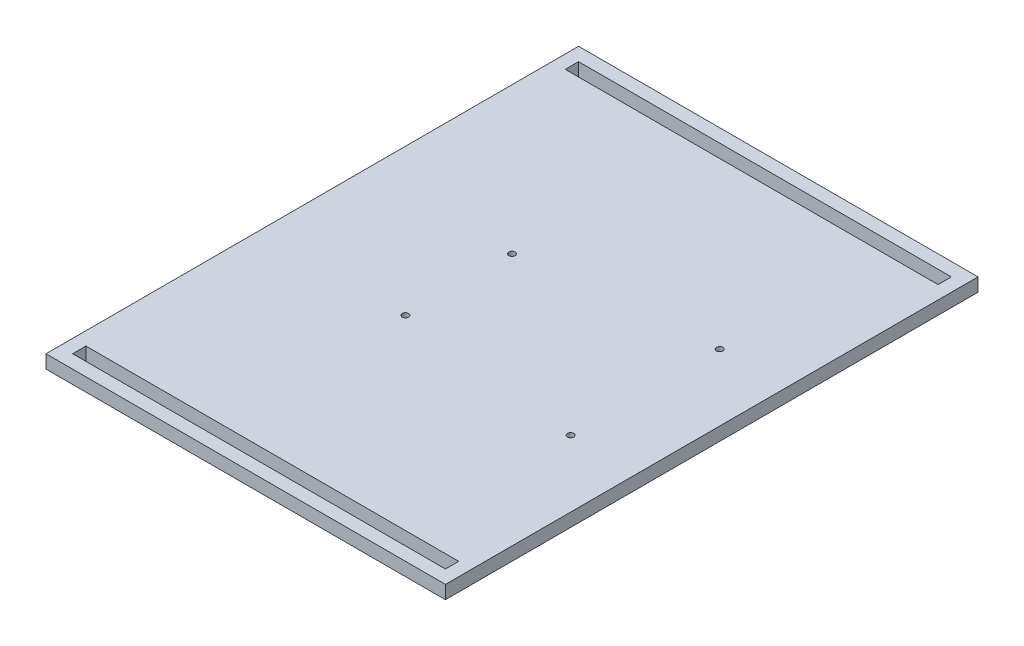
ISO-10303-21;
HEADER;
FILE_DESCRIPTION(('STEP AP214'),'2;1');
FILE_NAME('part.step','',(''),(''),'','','');
FILE_SCHEMA(('AUTOMOTIVE_DESIGN { 1 0 10303 214 1 1 1 1 }'));
ENDSEC;
DATA;
#1=APPLICATION_CONTEXT('core data for automotive mechanical design processes');
#2=APPLICATION_PROTOCOL_DEFINITION('international standard','automotive_design',2000,#1);
#3=PRODUCT_CONTEXT('',#1,'mechanical');
#4=PRODUCT('Part','Part','',(#3));
#5=PRODUCT_RELATED_PRODUCT_CATEGORY('part','',(#4));
#6=PRODUCT_DEFINITION_FORMATION('','',#4);
#7=PRODUCT_DEFINITION_CONTEXT('part definition',#1,'design');
#8=PRODUCT_DEFINITION('design','',#6,#7);
#9=PRODUCT_DEFINITION_SHAPE('','',#8);
#10=(LENGTH_UNIT() NAMED_UNIT(*) SI_UNIT(.MILLI.,.METRE.));
#11=(NAMED_UNIT(*) PLANE_ANGLE_UNIT() SI_UNIT($,.RADIAN.));
#12=(NAMED_UNIT(*) SI_UNIT($,.STERADIAN.) SOLID_ANGLE_UNIT());
#13=UNCERTAINTY_MEASURE_WITH_UNIT(LENGTH_MEASURE(1.E-05),#10,'distance_accuracy_value','');
#14=(GEOMETRIC_REPRESENTATION_CONTEXT(3) GLOBAL_UNCERTAINTY_ASSIGNED_CONTEXT((#13)) GLOBAL_UNIT_ASSIGNED_CONTEXT((#10,
#11,#12)) REPRESENTATION_CONTEXT('',''));
#15=CARTESIAN_POINT('',(0.,0.,0.));
#16=DIRECTION('',(0.,0.,1.));
#17=DIRECTION('',(1.,0.,0.));
#18=AXIS2_PLACEMENT_3D('',#15,#16,#17);
#19=CARTESIAN_POINT('',(-75.,100.,100.));
#20=DIRECTION('',(0.,0.,-1.));
#21=DIRECTION('',(-1.,0.,0.));
#22=AXIS2_PLACEMENT_3D('',#19,#20,#21);
#23=PLANE('',#22);
#24=DIRECTION('',(1.,0.,0.));
#25=VECTOR('',#24,1.);
#26=CARTESIAN_POINT('',(-75.,95.,100.));
#27=LINE('',#26,#25);
#28=CARTESIAN_POINT('',(-75.,95.,100.));
#29=VERTEX_POINT('',#28);
#30=CARTESIAN_POINT('',(75.,95.,100.));
#31=VERTEX_POINT('',#30);
#32=EDGE_CURVE('E181',#29,#31,#27,.T.);
#33=ORIENTED_EDGE('',*,*,#32,.T.);
#34=DIRECTION('',(0.,-1.,0.));
#35=VECTOR('',#34,1.);
#36=CARTESIAN_POINT('',(75.,100.,100.));
#37=LINE('',#36,#35);
#38=CARTESIAN_POINT('',(75.,100.,100.));
#39=VERTEX_POINT('',#38);
#40=EDGE_CURVE('E205',#39,#31,#37,.T.);
#41=ORIENTED_EDGE('',*,*,#40,.F.);
#42=DIRECTION('',(1.,0.,0.));
#43=VECTOR('',#42,1.);
#44=CARTESIAN_POINT('',(-75.,100.,100.));
#45=LINE('',#44,#43);
#46=CARTESIAN_POINT('',(-75.,100.,100.));
#47=VERTEX_POINT('',#46);
#48=EDGE_CURVE('E309',#47,#39,#45,.T.);
#49=ORIENTED_EDGE('',*,*,#48,.F.);
#50=DIRECTION('',(0.,-1.,0.));
#51=VECTOR('',#50,1.);
#52=CARTESIAN_POINT('',(-75.,100.,100.));
#53=LINE('',#52,#51);
#54=EDGE_CURVE('E197',#47,#29,#53,.T.);
#55=ORIENTED_EDGE('',*,*,#54,.T.);
#56=EDGE_LOOP('',(#33,#41,#49,#55));
#57=FACE_BOUND('',#56,.T.);
#58=ADVANCED_FACE('F83',(#57),#23,.F.);
#59=CARTESIAN_POINT('',(70.,100.,-100.));
#60=DIRECTION('',(-1.,0.,0.));
#61=DIRECTION('',(0.,0.,1.));
#62=AXIS2_PLACEMENT_3D('',#59,#60,#61);
#63=PLANE('',#62);
#64=DIRECTION('',(0.,0.,-1.));
#65=VECTOR('',#64,1.);
#66=CARTESIAN_POINT('',(70.,95.,-100.));
#67=LINE('',#66,#65);
#68=CARTESIAN_POINT('',(70.,95.,95.));
#69=VERTEX_POINT('',#68);
#70=CARTESIAN_POINT('',(70.,94.9999999999999,90.));
#71=VERTEX_POINT('',#70);
#72=EDGE_CURVE('E330',#69,#71,#67,.T.);
#73=ORIENTED_EDGE('',*,*,#72,.F.);
#74=DIRECTION('',(0.,1.,0.));
#75=VECTOR('',#74,1.);
#76=CARTESIAN_POINT('',(70.,-135.089257261219,95.));
#77=LINE('',#76,#75);
#78=CARTESIAN_POINT('',(70.,100.,95.));
#79=VERTEX_POINT('',#78);
#80=EDGE_CURVE('E290',#69,#79,#77,.T.);
#81=ORIENTED_EDGE('',*,*,#80,.T.);
#82=DIRECTION('',(0.,0.,-1.));
#83=VECTOR('',#82,1.);
#84=CARTESIAN_POINT('',(70.,100.,0.));
#85=LINE('',#84,#83);
#86=CARTESIAN_POINT('',(70.,100.,90.));
#87=VERTEX_POINT('',#86);
#88=EDGE_CURVE('E271',#79,#87,#85,.T.);
#89=ORIENTED_EDGE('',*,*,#88,.T.);
#90=DIRECTION('',(0.,1.,0.));
#91=VECTOR('',#90,1.);
#92=CARTESIAN_POINT('',(70.,-135.089257261219,90.));
#93=LINE('',#92,#91);
#94=EDGE_CURVE('E281',#71,#87,#93,.T.);
#95=ORIENTED_EDGE('',*,*,#94,.F.);
#96=EDGE_LOOP('',(#73,#81,#89,#95));
#97=FACE_BOUND('',#96,.T.);
#98=ADVANCED_FACE('F382',(#97),#63,.T.);
#99=CARTESIAN_POINT('',(-70.,100.,-100.));
#100=DIRECTION('',(1.,0.,0.));
#101=DIRECTION('',(0.,0.,-1.));
#102=AXIS2_PLACEMENT_3D('',#99,#100,#101);
#103=PLANE('',#102);
#104=DIRECTION('',(0.,0.,1.));
#105=VECTOR('',#104,1.);
#106=CARTESIAN_POINT('',(-70.,95.,-100.));
#107=LINE('',#106,#105);
#108=CARTESIAN_POINT('',(-70.,95.,-95.));
#109=VERTEX_POINT('',#108);
#110=CARTESIAN_POINT('',(-70.,95.,-90.));
#111=VERTEX_POINT('',#110);
#112=EDGE_CURVE('E192',#109,#111,#107,.T.);
#113=ORIENTED_EDGE('',*,*,#112,.F.);
#114=DIRECTION('',(0.,1.,0.));
#115=VECTOR('',#114,1.);
#116=CARTESIAN_POINT('',(-70.,-135.089257261219,-95.));
#117=LINE('',#116,#115);
#118=CARTESIAN_POINT('',(-70.,100.,-95.));
#119=VERTEX_POINT('',#118);
#120=EDGE_CURVE('E244',#109,#119,#117,.T.);
#121=ORIENTED_EDGE('',*,*,#120,.T.);
#122=DIRECTION('',(0.,0.,1.));
#123=VECTOR('',#122,1.);
#124=CARTESIAN_POINT('',(-69.9999999999998,100.,1.94289029309402E-13));
#125=LINE('',#124,#123);
#126=CARTESIAN_POINT('',(-70.,100.,-90.));
#127=VERTEX_POINT('',#126);
#128=EDGE_CURVE('E224',#119,#127,#125,.T.);
#129=ORIENTED_EDGE('',*,*,#128,.T.);
#130=DIRECTION('',(0.,1.,0.));
#131=VECTOR('',#130,1.);
#132=CARTESIAN_POINT('',(-70.,-135.089257261219,-90.));
#133=LINE('',#132,#131);
#134=EDGE_CURVE('E243',#111,#127,#133,.T.);
#135=ORIENTED_EDGE('',*,*,#134,.F.);
#136=EDGE_LOOP('',(#113,#121,#129,#135));
#137=FACE_BOUND('',#136,.T.);
#138=ADVANCED_FACE('F363',(#137),#103,.T.);
#139=CARTESIAN_POINT('',(70.,94.9999999999999,-90.));
#140=VERTEX_POINT('',#139);
#141=CARTESIAN_POINT('',(70.,95.,-95.));
#142=VERTEX_POINT('',#141);
#143=EDGE_CURVE('E362',#140,#142,#67,.T.);
#144=ORIENTED_EDGE('',*,*,#143,.F.);
#145=DIRECTION('',(0.,1.,0.));
#146=VECTOR('',#145,1.);
#147=CARTESIAN_POINT('',(70.,-135.089257261219,-90.));
#148=LINE('',#147,#146);
#149=CARTESIAN_POINT('',(70.,100.,-90.));
#150=VERTEX_POINT('',#149);
#151=EDGE_CURVE('E251',#140,#150,#148,.T.);
#152=ORIENTED_EDGE('',*,*,#151,.T.);
#153=DIRECTION('',(0.,0.,1.));
#154=VECTOR('',#153,1.);
#155=CARTESIAN_POINT('',(70.,100.,0.));
#156=LINE('',#155,#154);
#157=CARTESIAN_POINT('',(70.,100.,-95.));
#158=VERTEX_POINT('',#157);
#159=EDGE_CURVE('E235',#158,#150,#156,.T.);
#160=ORIENTED_EDGE('',*,*,#159,.F.);
#161=DIRECTION('',(0.,1.,0.));
#162=VECTOR('',#161,1.);
#163=CARTESIAN_POINT('',(70.,-135.089257261219,-95.));
#164=LINE('',#163,#162);
#165=EDGE_CURVE('E250',#142,#158,#164,.T.);
#166=ORIENTED_EDGE('',*,*,#165,.F.);
#167=EDGE_LOOP('',(#144,#152,#160,#166));
#168=FACE_BOUND('',#167,.T.);
#169=ADVANCED_FACE('F348',(#168),#63,.T.);
#170=CARTESIAN_POINT('',(0.,100.,0.));
#171=DIRECTION('',(0.,1.,0.));
#172=DIRECTION('',(0.,0.,1.));
#173=AXIS2_PLACEMENT_3D('',#170,#171,#172);
#174=PLANE('',#173);
#175=CARTESIAN_POINT('',(50.,100.,-28.));
#176=DIRECTION('',(0.,1.,0.));
#177=DIRECTION('',(0.,0.,1.));
#178=AXIS2_PLACEMENT_3D('',#175,#176,#177);
#179=CIRCLE('',#178,1.2);
#180=CARTESIAN_POINT('',(50.,100.,-26.8));
#181=VERTEX_POINT('',#180);
#182=EDGE_CURVE('E212',#181,#181,#179,.T.);
#183=ORIENTED_EDGE('',*,*,#182,.F.);
#184=EDGE_LOOP('',(#183));
#185=FACE_BOUND('',#184,.T.);
#186=CARTESIAN_POINT('',(-20.,100.,20.));
#187=DIRECTION('',(0.,1.,0.));
#188=DIRECTION('',(0.,0.,1.));
#189=AXIS2_PLACEMENT_3D('',#186,#187,#188);
#190=CIRCLE('',#189,1.2);
#191=CARTESIAN_POINT('',(-20.,100.,21.2));
#192=VERTEX_POINT('',#191);
#193=EDGE_CURVE('E316',#192,#192,#190,.T.);
#194=ORIENTED_EDGE('',*,*,#193,.F.);
#195=EDGE_LOOP('',(#194));
#196=FACE_BOUND('',#195,.T.);
#197=CARTESIAN_POINT('',(-20.,100.,-20.));
#198=DIRECTION('',(0.,1.,0.));
#199=DIRECTION('',(0.,0.,1.));
#200=AXIS2_PLACEMENT_3D('',#197,#198,#199);
#201=CIRCLE('',#200,1.2);
#202=CARTESIAN_POINT('',(-20.,100.,-18.8));
#203=VERTEX_POINT('',#202);
#204=EDGE_CURVE('E233',#203,#203,#201,.T.);
#205=ORIENTED_EDGE('',*,*,#204,.F.);
#206=EDGE_LOOP('',(#205));
#207=FACE_BOUND('',#206,.T.);
#208=CARTESIAN_POINT('',(50.,100.,28.));
#209=DIRECTION('',(0.,1.,0.));
#210=DIRECTION('',(0.,0.,1.));
#211=AXIS2_PLACEMENT_3D('',#208,#209,#210);
#212=CIRCLE('',#211,1.2);
#213=CARTESIAN_POINT('',(50.,100.,29.2));
#214=VERTEX_POINT('',#213);
#215=EDGE_CURVE('E331',#214,#214,#212,.T.);
#216=ORIENTED_EDGE('',*,*,#215,.F.);
#217=EDGE_LOOP('',(#216));
#218=FACE_BOUND('',#217,.T.);
#219=DIRECTION('',(0.,0.,-1.));
#220=VECTOR('',#219,1.);
#221=CARTESIAN_POINT('',(75.,100.,-100.));
#222=LINE('',#221,#220);
#223=CARTESIAN_POINT('',(75.,100.,-100.));
#224=VERTEX_POINT('',#223);
#225=EDGE_CURVE('E297',#39,#224,#222,.T.);
#226=ORIENTED_EDGE('',*,*,#225,.T.);
#227=DIRECTION('',(-1.,0.,0.));
#228=VECTOR('',#227,1.);
#229=CARTESIAN_POINT('',(-75.,100.,-100.));
#230=LINE('',#229,#228);
#231=CARTESIAN_POINT('',(-75.,100.,-100.));
#232=VERTEX_POINT('',#231);
#233=EDGE_CURVE('E302',#224,#232,#230,.T.);
#234=ORIENTED_EDGE('',*,*,#233,.T.);
#235=DIRECTION('',(0.,0.,1.));
#236=VECTOR('',#235,1.);
#237=CARTESIAN_POINT('',(-75.,100.,-100.));
#238=LINE('',#237,#236);
#239=EDGE_CURVE('E200',#232,#47,#238,.T.);
#240=ORIENTED_EDGE('',*,*,#239,.T.);
#241=ORIENTED_EDGE('',*,*,#48,.T.);
#242=EDGE_LOOP('',(#226,#234,#240,#241));
#243=FACE_BOUND('',#242,.T.);
#244=ORIENTED_EDGE('',*,*,#88,.F.);
#245=DIRECTION('',(-1.,0.,0.));
#246=VECTOR('',#245,1.);
#247=CARTESIAN_POINT('',(0.,100.,95.));
#248=LINE('',#247,#246);
#249=CARTESIAN_POINT('',(-70.,100.,95.));
#250=VERTEX_POINT('',#249);
#251=EDGE_CURVE('E270',#79,#250,#248,.T.);
#252=ORIENTED_EDGE('',*,*,#251,.T.);
#253=DIRECTION('',(0.,0.,-1.));
#254=VECTOR('',#253,1.);
#255=CARTESIAN_POINT('',(-69.9999999999998,100.,-1.94289029309402E-13));
#256=LINE('',#255,#254);
#257=CARTESIAN_POINT('',(-70.,100.,90.));
#258=VERTEX_POINT('',#257);
#259=EDGE_CURVE('E261',#250,#258,#256,.T.);
#260=ORIENTED_EDGE('',*,*,#259,.T.);
#261=DIRECTION('',(-1.,0.,0.));
#262=VECTOR('',#261,1.);
#263=CARTESIAN_POINT('',(0.,100.,90.));
#264=LINE('',#263,#262);
#265=EDGE_CURVE('E274',#87,#258,#264,.T.);
#266=ORIENTED_EDGE('',*,*,#265,.F.);
#267=EDGE_LOOP('',(#244,#252,#260,#266));
#268=FACE_BOUND('',#267,.T.);
#269=ORIENTED_EDGE('',*,*,#159,.T.);
#270=DIRECTION('',(-1.,0.,0.));
#271=VECTOR('',#270,1.);
#272=CARTESIAN_POINT('',(0.,100.,-90.));
#273=LINE('',#272,#271);
#274=EDGE_CURVE('E222',#150,#127,#273,.T.);
#275=ORIENTED_EDGE('',*,*,#274,.T.);
#276=ORIENTED_EDGE('',*,*,#128,.F.);
#277=DIRECTION('',(-1.,0.,0.));
#278=VECTOR('',#277,1.);
#279=CARTESIAN_POINT('',(0.,100.,-95.));
#280=LINE('',#279,#278);
#281=EDGE_CURVE('E113',#158,#119,#280,.T.);
#282=ORIENTED_EDGE('',*,*,#281,.F.);
#283=EDGE_LOOP('',(#269,#275,#276,#282));
#284=FACE_BOUND('',#283,.T.);
#285=ADVANCED_FACE('F344',(#185,#196,#207,#218,#243,#268,#284),#174,.T.);
#286=CARTESIAN_POINT('',(-75.,100.,-100.));
#287=DIRECTION('',(0.,0.,1.));
#288=DIRECTION('',(1.,0.,0.));
#289=AXIS2_PLACEMENT_3D('',#286,#287,#288);
#290=PLANE('',#289);
#291=DIRECTION('',(0.,-1.,0.));
#292=VECTOR('',#291,1.);
#293=CARTESIAN_POINT('',(75.,100.,-100.));
#294=LINE('',#293,#292);
#295=CARTESIAN_POINT('',(75.,95.,-100.));
#296=VERTEX_POINT('',#295);
#297=EDGE_CURVE('E12',#224,#296,#294,.T.);
#298=ORIENTED_EDGE('',*,*,#297,.T.);
#299=DIRECTION('',(-1.,0.,0.));
#300=VECTOR('',#299,1.);
#301=CARTESIAN_POINT('',(-75.,95.,-100.));
#302=LINE('',#301,#300);
#303=CARTESIAN_POINT('',(-75.,95.,-100.));
#304=VERTEX_POINT('',#303);
#305=EDGE_CURVE('E103',#296,#304,#302,.T.);
#306=ORIENTED_EDGE('',*,*,#305,.T.);
#307=DIRECTION('',(0.,-1.,0.));
#308=VECTOR('',#307,1.);
#309=CARTESIAN_POINT('',(-75.,100.,-100.));
#310=LINE('',#309,#308);
#311=EDGE_CURVE('E91',#232,#304,#310,.T.);
#312=ORIENTED_EDGE('',*,*,#311,.F.);
#313=ORIENTED_EDGE('',*,*,#233,.F.);
#314=EDGE_LOOP('',(#298,#306,#312,#313));
#315=FACE_BOUND('',#314,.T.);
#316=ADVANCED_FACE('F178',(#315),#290,.F.);
#317=CARTESIAN_POINT('',(75.,100.,-100.));
#318=DIRECTION('',(-1.,0.,0.));
#319=DIRECTION('',(0.,0.,1.));
#320=AXIS2_PLACEMENT_3D('',#317,#318,#319);
#321=PLANE('',#320);
#322=ORIENTED_EDGE('',*,*,#40,.T.);
#323=DIRECTION('',(0.,0.,-1.));
#324=VECTOR('',#323,1.);
#325=CARTESIAN_POINT('',(75.,95.,-100.));
#326=LINE('',#325,#324);
#327=EDGE_CURVE('E317',#31,#296,#326,.T.);
#328=ORIENTED_EDGE('',*,*,#327,.T.);
#329=ORIENTED_EDGE('',*,*,#297,.F.);
#330=ORIENTED_EDGE('',*,*,#225,.F.);
#331=EDGE_LOOP('',(#322,#328,#329,#330));
#332=FACE_BOUND('',#331,.T.);
#333=ADVANCED_FACE('F90',(#332),#321,.F.);
#334=CARTESIAN_POINT('',(-75.,100.,-100.));
#335=DIRECTION('',(1.,0.,0.));
#336=DIRECTION('',(0.,0.,-1.));
#337=AXIS2_PLACEMENT_3D('',#334,#335,#336);
#338=PLANE('',#337);
#339=ORIENTED_EDGE('',*,*,#311,.T.);
#340=DIRECTION('',(0.,0.,1.));
#341=VECTOR('',#340,1.);
#342=CARTESIAN_POINT('',(-75.,95.,-100.));
#343=LINE('',#342,#341);
#344=EDGE_CURVE('E190',#304,#29,#343,.T.);
#345=ORIENTED_EDGE('',*,*,#344,.T.);
#346=ORIENTED_EDGE('',*,*,#54,.F.);
#347=ORIENTED_EDGE('',*,*,#239,.F.);
#348=EDGE_LOOP('',(#339,#345,#346,#347));
#349=FACE_BOUND('',#348,.T.);
#350=ADVANCED_FACE('F196',(#349),#338,.F.);
#351=CARTESIAN_POINT('',(-70.,95.,90.));
#352=VERTEX_POINT('',#351);
#353=CARTESIAN_POINT('',(-70.,94.9999999999999,95.));
#354=VERTEX_POINT('',#353);
#355=EDGE_CURVE('E324',#352,#354,#107,.T.);
#356=ORIENTED_EDGE('',*,*,#355,.F.);
#357=DIRECTION('',(0.,1.,0.));
#358=VECTOR('',#357,1.);
#359=CARTESIAN_POINT('',(-70.,-135.089257261219,90.));
#360=LINE('',#359,#358);
#361=EDGE_CURVE('E278',#352,#258,#360,.T.);
#362=ORIENTED_EDGE('',*,*,#361,.T.);
#363=ORIENTED_EDGE('',*,*,#259,.F.);
#364=DIRECTION('',(0.,1.,0.));
#365=VECTOR('',#364,1.);
#366=CARTESIAN_POINT('',(-70.,-135.089257261219,95.));
#367=LINE('',#366,#365);
#368=EDGE_CURVE('E277',#354,#250,#367,.T.);
#369=ORIENTED_EDGE('',*,*,#368,.F.);
#370=EDGE_LOOP('',(#356,#362,#363,#369));
#371=FACE_BOUND('',#370,.T.);
#372=ADVANCED_FACE('F383',(#371),#103,.T.);
#373=CARTESIAN_POINT('',(0.,95.,0.));
#374=DIRECTION('',(0.,1.,0.));
#375=DIRECTION('',(0.,0.,1.));
#376=AXIS2_PLACEMENT_3D('',#373,#374,#375);
#377=PLANE('',#376);
#378=DIRECTION('',(-1.,0.,0.));
#379=VECTOR('',#378,1.);
#380=CARTESIAN_POINT('',(0.,95.,95.));
#381=LINE('',#380,#379);
#382=EDGE_CURVE('E185',#69,#354,#381,.T.);
#383=ORIENTED_EDGE('',*,*,#382,.F.);
#384=ORIENTED_EDGE('',*,*,#72,.T.);
#385=DIRECTION('',(-1.,0.,0.));
#386=VECTOR('',#385,1.);
#387=CARTESIAN_POINT('',(0.,95.,90.));
#388=LINE('',#387,#386);
#389=EDGE_CURVE('E284',#71,#352,#388,.T.);
#390=ORIENTED_EDGE('',*,*,#389,.T.);
#391=ORIENTED_EDGE('',*,*,#355,.T.);
#392=EDGE_LOOP('',(#383,#384,#390,#391));
#393=FACE_BOUND('',#392,.T.);
#394=DIRECTION('',(-1.,0.,0.));
#395=VECTOR('',#394,1.);
#396=CARTESIAN_POINT('',(0.,95.,-90.));
#397=LINE('',#396,#395);
#398=EDGE_CURVE('E260',#140,#111,#397,.T.);
#399=ORIENTED_EDGE('',*,*,#398,.F.);
#400=ORIENTED_EDGE('',*,*,#143,.T.);
#401=DIRECTION('',(-1.,0.,0.));
#402=VECTOR('',#401,1.);
#403=CARTESIAN_POINT('',(0.,95.,-95.));
#404=LINE('',#403,#402);
#405=EDGE_CURVE('E246',#142,#109,#404,.T.);
#406=ORIENTED_EDGE('',*,*,#405,.T.);
#407=ORIENTED_EDGE('',*,*,#112,.T.);
#408=EDGE_LOOP('',(#399,#400,#406,#407));
#409=FACE_BOUND('',#408,.T.);
#410=ORIENTED_EDGE('',*,*,#305,.F.);
#411=ORIENTED_EDGE('',*,*,#327,.F.);
#412=ORIENTED_EDGE('',*,*,#32,.F.);
#413=ORIENTED_EDGE('',*,*,#344,.F.);
#414=EDGE_LOOP('',(#410,#411,#412,#413));
#415=FACE_BOUND('',#414,.T.);
#416=CARTESIAN_POINT('',(50.,95.,-28.));
#417=DIRECTION('',(0.,1.,0.));
#418=DIRECTION('',(0.,0.,1.));
#419=AXIS2_PLACEMENT_3D('',#416,#417,#418);
#420=CIRCLE('',#419,1.2);
#421=CARTESIAN_POINT('',(50.,95.,-26.8));
#422=VERTEX_POINT('',#421);
#423=EDGE_CURVE('E86',#422,#422,#420,.T.);
#424=ORIENTED_EDGE('',*,*,#423,.T.);
#425=EDGE_LOOP('',(#424));
#426=FACE_BOUND('',#425,.T.);
#427=CARTESIAN_POINT('',(-20.,95.,20.));
#428=DIRECTION('',(0.,1.,0.));
#429=DIRECTION('',(0.,0.,1.));
#430=AXIS2_PLACEMENT_3D('',#427,#428,#429);
#431=CIRCLE('',#430,1.2);
#432=CARTESIAN_POINT('',(-20.,95.,21.2));
#433=VERTEX_POINT('',#432);
#434=EDGE_CURVE('E211',#433,#433,#431,.T.);
#435=ORIENTED_EDGE('',*,*,#434,.T.);
#436=EDGE_LOOP('',(#435));
#437=FACE_BOUND('',#436,.T.);
#438=CARTESIAN_POINT('',(-20.,95.,-20.));
#439=DIRECTION('',(0.,1.,0.));
#440=DIRECTION('',(0.,0.,1.));
#441=AXIS2_PLACEMENT_3D('',#438,#439,#440);
#442=CIRCLE('',#441,1.2);
#443=CARTESIAN_POINT('',(-20.,95.,-18.8));
#444=VERTEX_POINT('',#443);
#445=EDGE_CURVE('E208',#444,#444,#442,.T.);
#446=ORIENTED_EDGE('',*,*,#445,.T.);
#447=EDGE_LOOP('',(#446));
#448=FACE_BOUND('',#447,.T.);
#449=CARTESIAN_POINT('',(50.,95.,28.));
#450=DIRECTION('',(0.,1.,0.));
#451=DIRECTION('',(0.,0.,1.));
#452=AXIS2_PLACEMENT_3D('',#449,#450,#451);
#453=CIRCLE('',#452,1.2);
#454=CARTESIAN_POINT('',(50.,95.,29.2));
#455=VERTEX_POINT('',#454);
#456=EDGE_CURVE('E207',#455,#455,#453,.T.);
#457=ORIENTED_EDGE('',*,*,#456,.T.);
#458=EDGE_LOOP('',(#457));
#459=FACE_BOUND('',#458,.T.);
#460=ADVANCED_FACE('F186',(#393,#409,#415,#426,#437,#448,#459),#377,.F.);
#461=CARTESIAN_POINT('',(0.,-135.089257261219,95.));
#462=DIRECTION('',(0.,0.,-1.));
#463=DIRECTION('',(-1.,0.,0.));
#464=AXIS2_PLACEMENT_3D('',#461,#462,#463);
#465=PLANE('',#464);
#466=ORIENTED_EDGE('',*,*,#382,.T.);
#467=ORIENTED_EDGE('',*,*,#368,.T.);
#468=ORIENTED_EDGE('',*,*,#251,.F.);
#469=ORIENTED_EDGE('',*,*,#80,.F.);
#470=EDGE_LOOP('',(#466,#467,#468,#469));
#471=FACE_BOUND('',#470,.T.);
#472=ADVANCED_FACE('F389',(#471),#465,.T.);
#473=CARTESIAN_POINT('',(0.,-135.089257261219,90.));
#474=DIRECTION('',(0.,0.,-1.));
#475=DIRECTION('',(-1.,0.,0.));
#476=AXIS2_PLACEMENT_3D('',#473,#474,#475);
#477=PLANE('',#476);
#478=ORIENTED_EDGE('',*,*,#94,.T.);
#479=ORIENTED_EDGE('',*,*,#265,.T.);
#480=ORIENTED_EDGE('',*,*,#361,.F.);
#481=ORIENTED_EDGE('',*,*,#389,.F.);
#482=EDGE_LOOP('',(#478,#479,#480,#481));
#483=FACE_BOUND('',#482,.T.);
#484=ADVANCED_FACE('F379',(#483),#477,.F.);
#485=CARTESIAN_POINT('',(0.,-135.089257261219,-90.));
#486=DIRECTION('',(0.,0.,-1.));
#487=DIRECTION('',(-1.,0.,0.));
#488=AXIS2_PLACEMENT_3D('',#485,#486,#487);
#489=PLANE('',#488);
#490=ORIENTED_EDGE('',*,*,#398,.T.);
#491=ORIENTED_EDGE('',*,*,#134,.T.);
#492=ORIENTED_EDGE('',*,*,#274,.F.);
#493=ORIENTED_EDGE('',*,*,#151,.F.);
#494=EDGE_LOOP('',(#490,#491,#492,#493));
#495=FACE_BOUND('',#494,.T.);
#496=ADVANCED_FACE('F361',(#495),#489,.T.);
#497=CARTESIAN_POINT('',(0.,-135.089257261219,-95.));
#498=DIRECTION('',(0.,0.,-1.));
#499=DIRECTION('',(-1.,0.,0.));
#500=AXIS2_PLACEMENT_3D('',#497,#498,#499);
#501=PLANE('',#500);
#502=ORIENTED_EDGE('',*,*,#165,.T.);
#503=ORIENTED_EDGE('',*,*,#281,.T.);
#504=ORIENTED_EDGE('',*,*,#120,.F.);
#505=ORIENTED_EDGE('',*,*,#405,.F.);
#506=EDGE_LOOP('',(#502,#503,#504,#505));
#507=FACE_BOUND('',#506,.T.);
#508=ADVANCED_FACE('F369',(#507),#501,.F.);
#509=CARTESIAN_POINT('',(50.,90.,28.));
#510=DIRECTION('',(0.,1.,0.));
#511=DIRECTION('',(0.,0.,1.));
#512=AXIS2_PLACEMENT_3D('',#509,#510,#511);
#513=CYLINDRICAL_SURFACE('',#512,1.2);
#514=ORIENTED_EDGE('',*,*,#215,.T.);
#515=EDGE_LOOP('',(#514));
#516=FACE_BOUND('',#515,.T.);
#517=ORIENTED_EDGE('',*,*,#456,.F.);
#518=EDGE_LOOP('',(#517));
#519=FACE_BOUND('',#518,.T.);
#520=ADVANCED_FACE('F505',(#516,#519),#513,.F.);
#521=CARTESIAN_POINT('',(-20.,90.,-20.));
#522=DIRECTION('',(0.,1.,0.));
#523=DIRECTION('',(0.,0.,1.));
#524=AXIS2_PLACEMENT_3D('',#521,#522,#523);
#525=CYLINDRICAL_SURFACE('',#524,1.2);
#526=ORIENTED_EDGE('',*,*,#204,.T.);
#527=EDGE_LOOP('',(#526));
#528=FACE_BOUND('',#527,.T.);
#529=ORIENTED_EDGE('',*,*,#445,.F.);
#530=EDGE_LOOP('',(#529));
#531=FACE_BOUND('',#530,.T.);
#532=ADVANCED_FACE('F345',(#528,#531),#525,.F.);
#533=CARTESIAN_POINT('',(-20.,90.,20.));
#534=DIRECTION('',(0.,1.,0.));
#535=DIRECTION('',(0.,0.,1.));
#536=AXIS2_PLACEMENT_3D('',#533,#534,#535);
#537=CYLINDRICAL_SURFACE('',#536,1.2);
#538=ORIENTED_EDGE('',*,*,#193,.T.);
#539=EDGE_LOOP('',(#538));
#540=FACE_BOUND('',#539,.T.);
#541=ORIENTED_EDGE('',*,*,#434,.F.);
#542=EDGE_LOOP('',(#541));
#543=FACE_BOUND('',#542,.T.);
#544=ADVANCED_FACE('F485',(#540,#543),#537,.F.);
#545=CARTESIAN_POINT('',(50.,90.,-28.));
#546=DIRECTION('',(0.,1.,0.));
#547=DIRECTION('',(0.,0.,1.));
#548=AXIS2_PLACEMENT_3D('',#545,#546,#547);
#549=CYLINDRICAL_SURFACE('',#548,1.2);
#550=ORIENTED_EDGE('',*,*,#182,.T.);
#551=EDGE_LOOP('',(#550));
#552=FACE_BOUND('',#551,.T.);
#553=ORIENTED_EDGE('',*,*,#423,.F.);
#554=EDGE_LOOP('',(#553));
#555=FACE_BOUND('',#554,.T.);
#556=ADVANCED_FACE('F479',(#552,#555),#549,.F.);
#557=CLOSED_SHELL('',(#58,#98,#138,#169,#285,#316,#333,#350,#372,#460,#472,#484,#496,#508,#520,
#532,#544,#556));
#558=MANIFOLD_SOLID_BREP('B2',#557);
#559=ADVANCED_BREP_SHAPE_REPRESENTATION('',(#18,#558),#14);
#560=SHAPE_DEFINITION_REPRESENTATION(#9,#559);
ENDSEC;
END-ISO-10303-21;
